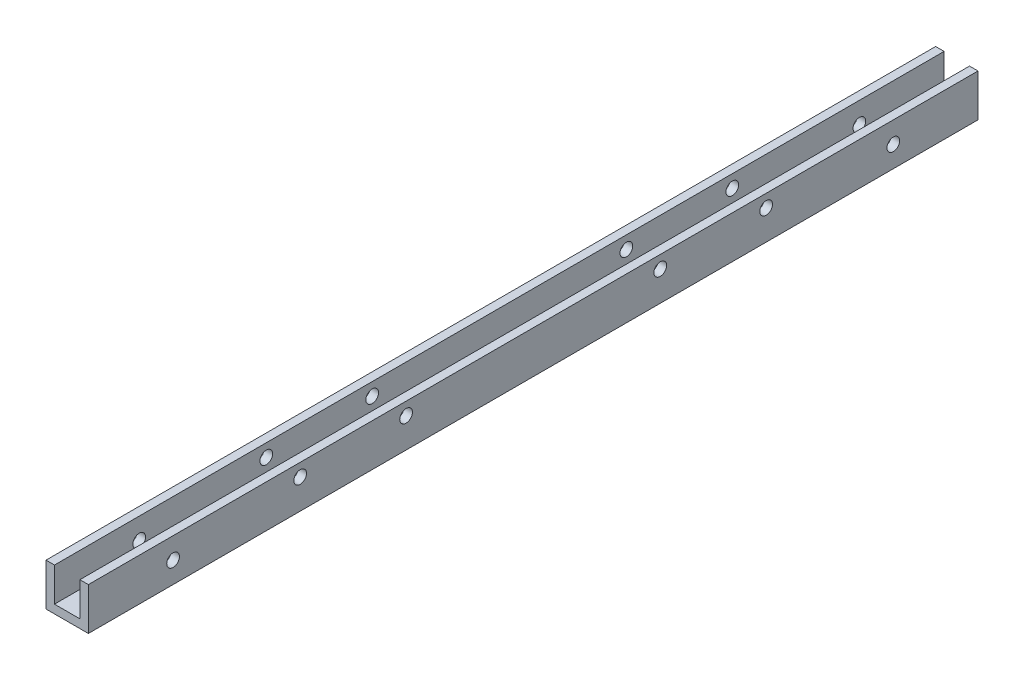
ISO-10303-21;
HEADER;
FILE_DESCRIPTION(('STEP AP214'),'2;1');
FILE_NAME('part.step','',(''),(''),'','','');
FILE_SCHEMA(('AUTOMOTIVE_DESIGN { 1 0 10303 214 1 1 1 1 }'));
ENDSEC;
DATA;
#1=APPLICATION_CONTEXT('core data for automotive mechanical design processes');
#2=APPLICATION_PROTOCOL_DEFINITION('international standard','automotive_design',2000,#1);
#3=PRODUCT_CONTEXT('',#1,'mechanical');
#4=PRODUCT('Part','Part','',(#3));
#5=PRODUCT_RELATED_PRODUCT_CATEGORY('part','',(#4));
#6=PRODUCT_DEFINITION_FORMATION('','',#4);
#7=PRODUCT_DEFINITION_CONTEXT('part definition',#1,'design');
#8=PRODUCT_DEFINITION('design','',#6,#7);
#9=PRODUCT_DEFINITION_SHAPE('','',#8);
#10=(LENGTH_UNIT() NAMED_UNIT(*) SI_UNIT(.MILLI.,.METRE.));
#11=(NAMED_UNIT(*) PLANE_ANGLE_UNIT() SI_UNIT($,.RADIAN.));
#12=(NAMED_UNIT(*) SI_UNIT($,.STERADIAN.) SOLID_ANGLE_UNIT());
#13=UNCERTAINTY_MEASURE_WITH_UNIT(LENGTH_MEASURE(1.E-05),#10,'distance_accuracy_value','');
#14=(GEOMETRIC_REPRESENTATION_CONTEXT(3) GLOBAL_UNCERTAINTY_ASSIGNED_CONTEXT((#13)) GLOBAL_UNIT_ASSIGNED_CONTEXT((#10,
#11,#12)) REPRESENTATION_CONTEXT('',''));
#15=CARTESIAN_POINT('',(0.,0.,0.));
#16=DIRECTION('',(0.,0.,1.));
#17=DIRECTION('',(1.,0.,0.));
#18=AXIS2_PLACEMENT_3D('',#15,#16,#17);
#19=CARTESIAN_POINT('',(-5.47826086956522,3.67391304347826,210.));
#20=DIRECTION('',(1.,0.,0.));
#21=DIRECTION('',(0.,0.,-1.));
#22=AXIS2_PLACEMENT_3D('',#19,#20,#21);
#23=PLANE('',#22);
#24=CARTESIAN_POINT('',(-5.47826086956522,-1.32608695652174,20.));
#25=DIRECTION('',(1.,0.,0.));
#26=DIRECTION('',(0.,1.,0.));
#27=AXIS2_PLACEMENT_3D('',#24,#25,#26);
#28=CIRCLE('',#27,1.5);
#29=CARTESIAN_POINT('',(-5.47826086956522,0.173913043478258,20.));
#30=VERTEX_POINT('',#29);
#31=EDGE_CURVE('E208',#30,#30,#28,.T.);
#32=ORIENTED_EDGE('',*,*,#31,.T.);
#33=EDGE_LOOP('',(#32));
#34=FACE_BOUND('',#33,.T.);
#35=CARTESIAN_POINT('',(-5.47826086956522,-1.32608695652174,190.));
#36=DIRECTION('',(1.,0.,0.));
#37=DIRECTION('',(0.,1.,0.));
#38=AXIS2_PLACEMENT_3D('',#35,#36,#37);
#39=CIRCLE('',#38,1.5);
#40=CARTESIAN_POINT('',(-5.47826086956522,0.173913043478255,190.));
#41=VERTEX_POINT('',#40);
#42=EDGE_CURVE('E324',#41,#41,#39,.T.);
#43=ORIENTED_EDGE('',*,*,#42,.T.);
#44=EDGE_LOOP('',(#43));
#45=FACE_BOUND('',#44,.T.);
#46=CARTESIAN_POINT('',(-5.47826086956522,0.673913043478259,160.));
#47=DIRECTION('',(1.,0.,0.));
#48=DIRECTION('',(0.,1.,0.));
#49=AXIS2_PLACEMENT_3D('',#46,#47,#48);
#50=CIRCLE('',#49,1.5);
#51=CARTESIAN_POINT('',(-5.47826086956522,2.17391304347826,160.));
#52=VERTEX_POINT('',#51);
#53=EDGE_CURVE('E189',#52,#52,#50,.T.);
#54=ORIENTED_EDGE('',*,*,#53,.T.);
#55=EDGE_LOOP('',(#54));
#56=FACE_BOUND('',#55,.T.);
#57=CARTESIAN_POINT('',(-5.47826086956522,0.673913043478261,135.));
#58=DIRECTION('',(1.,0.,0.));
#59=DIRECTION('',(0.,1.,0.));
#60=AXIS2_PLACEMENT_3D('',#57,#58,#59);
#61=CIRCLE('',#60,1.5);
#62=CARTESIAN_POINT('',(-5.47826086956522,2.17391304347826,135.));
#63=VERTEX_POINT('',#62);
#64=EDGE_CURVE('E235',#63,#63,#61,.T.);
#65=ORIENTED_EDGE('',*,*,#64,.T.);
#66=EDGE_LOOP('',(#65));
#67=FACE_BOUND('',#66,.T.);
#68=CARTESIAN_POINT('',(-5.47826086956522,0.67391304347828,75.));
#69=DIRECTION('',(1.,0.,0.));
#70=DIRECTION('',(0.,1.,0.));
#71=AXIS2_PLACEMENT_3D('',#68,#69,#70);
#72=CIRCLE('',#71,1.50000000000001);
#73=CARTESIAN_POINT('',(-5.47826086956522,2.17391304347829,75.));
#74=VERTEX_POINT('',#73);
#75=EDGE_CURVE('E243',#74,#74,#72,.T.);
#76=ORIENTED_EDGE('',*,*,#75,.T.);
#77=EDGE_LOOP('',(#76));
#78=FACE_BOUND('',#77,.T.);
#79=CARTESIAN_POINT('',(-5.47826086956522,0.673913043478316,50.));
#80=DIRECTION('',(1.,0.,0.));
#81=DIRECTION('',(0.,1.,0.));
#82=AXIS2_PLACEMENT_3D('',#79,#80,#81);
#83=CIRCLE('',#82,1.5);
#84=CARTESIAN_POINT('',(-5.47826086956522,2.17391304347831,50.));
#85=VERTEX_POINT('',#84);
#86=EDGE_CURVE('E251',#85,#85,#83,.T.);
#87=ORIENTED_EDGE('',*,*,#86,.T.);
#88=EDGE_LOOP('',(#87));
#89=FACE_BOUND('',#88,.T.);
#90=DIRECTION('',(0.,-1.,0.));
#91=VECTOR('',#90,1.);
#92=CARTESIAN_POINT('',(-5.47826086956522,3.67391304347826,0.));
#93=LINE('',#92,#91);
#94=CARTESIAN_POINT('',(-5.47826086956522,3.67391304347826,0.));
#95=VERTEX_POINT('',#94);
#96=CARTESIAN_POINT('',(-5.47826086956522,-6.32608695652174,0.));
#97=VERTEX_POINT('',#96);
#98=EDGE_CURVE('E143',#95,#97,#93,.T.);
#99=ORIENTED_EDGE('',*,*,#98,.T.);
#100=DIRECTION('',(0.,0.,-1.));
#101=VECTOR('',#100,1.);
#102=CARTESIAN_POINT('',(-5.47826086956522,-6.32608695652174,210.));
#103=LINE('',#102,#101);
#104=CARTESIAN_POINT('',(-5.47826086956522,-6.32608695652174,210.));
#105=VERTEX_POINT('',#104);
#106=EDGE_CURVE('E11',#105,#97,#103,.T.);
#107=ORIENTED_EDGE('',*,*,#106,.F.);
#108=DIRECTION('',(0.,-1.,0.));
#109=VECTOR('',#108,1.);
#110=CARTESIAN_POINT('',(-5.47826086956522,3.67391304347826,210.));
#111=LINE('',#110,#109);
#112=CARTESIAN_POINT('',(-5.47826086956522,3.67391304347826,210.));
#113=VERTEX_POINT('',#112);
#114=EDGE_CURVE('E166',#113,#105,#111,.T.);
#115=ORIENTED_EDGE('',*,*,#114,.F.);
#116=DIRECTION('',(0.,0.,-1.));
#117=VECTOR('',#116,1.);
#118=CARTESIAN_POINT('',(-5.47826086956522,3.67391304347826,210.));
#119=LINE('',#118,#117);
#120=EDGE_CURVE('E139',#113,#95,#119,.T.);
#121=ORIENTED_EDGE('',*,*,#120,.T.);
#122=EDGE_LOOP('',(#99,#107,#115,#121));
#123=FACE_BOUND('',#122,.T.);
#124=ADVANCED_FACE('F40',(#34,#45,#56,#67,#78,#89,#123),#23,.F.);
#125=CARTESIAN_POINT('',(-5.47826086956522,-6.32608695652174,210.));
#126=DIRECTION('',(0.,1.,0.));
#127=DIRECTION('',(-1.,0.,0.));
#128=AXIS2_PLACEMENT_3D('',#125,#126,#127);
#129=PLANE('',#128);
#130=CARTESIAN_POINT('',(-0.478260869565221,-6.32608695652174,105.));
#131=DIRECTION('',(0.,-1.,0.));
#132=DIRECTION('',(1.,0.,0.));
#133=AXIS2_PLACEMENT_3D('',#130,#131,#132);
#134=CIRCLE('',#133,2.5);
#135=CARTESIAN_POINT('',(2.02173913043478,-6.32608695652174,105.));
#136=VERTEX_POINT('',#135);
#137=EDGE_CURVE('E557',#136,#136,#134,.T.);
#138=ORIENTED_EDGE('',*,*,#137,.F.);
#139=EDGE_LOOP('',(#138));
#140=FACE_BOUND('',#139,.T.);
#141=DIRECTION('',(1.,0.,0.));
#142=VECTOR('',#141,1.);
#143=CARTESIAN_POINT('',(-5.47826086956522,-6.32608695652174,0.));
#144=LINE('',#143,#142);
#145=CARTESIAN_POINT('',(4.52173913043478,-6.32608695652174,0.));
#146=VERTEX_POINT('',#145);
#147=EDGE_CURVE('E147',#97,#146,#144,.T.);
#148=ORIENTED_EDGE('',*,*,#147,.T.);
#149=DIRECTION('',(0.,0.,-1.));
#150=VECTOR('',#149,1.);
#151=CARTESIAN_POINT('',(4.52173913043478,-6.32608695652174,210.));
#152=LINE('',#151,#150);
#153=CARTESIAN_POINT('',(4.52173913043478,-6.32608695652174,210.));
#154=VERTEX_POINT('',#153);
#155=EDGE_CURVE('E50',#154,#146,#152,.T.);
#156=ORIENTED_EDGE('',*,*,#155,.F.);
#157=DIRECTION('',(1.,0.,0.));
#158=VECTOR('',#157,1.);
#159=CARTESIAN_POINT('',(-5.47826086956522,-6.32608695652174,210.));
#160=LINE('',#159,#158);
#161=EDGE_CURVE('E102',#105,#154,#160,.T.);
#162=ORIENTED_EDGE('',*,*,#161,.F.);
#163=ORIENTED_EDGE('',*,*,#106,.T.);
#164=EDGE_LOOP('',(#148,#156,#162,#163));
#165=FACE_BOUND('',#164,.T.);
#166=ADVANCED_FACE('F309',(#140,#165),#129,.F.);
#167=CARTESIAN_POINT('',(4.52173913043478,3.67391304347826,210.));
#168=DIRECTION('',(-1.,0.,0.));
#169=DIRECTION('',(0.,-1.,0.));
#170=AXIS2_PLACEMENT_3D('',#167,#168,#169);
#171=PLANE('',#170);
#172=CARTESIAN_POINT('',(4.52173913043478,-1.32608695652174,20.));
#173=DIRECTION('',(1.,0.,0.));
#174=DIRECTION('',(0.,1.,0.));
#175=AXIS2_PLACEMENT_3D('',#172,#173,#174);
#176=CIRCLE('',#175,1.5);
#177=CARTESIAN_POINT('',(4.52173913043478,0.173913043478261,20.));
#178=VERTEX_POINT('',#177);
#179=EDGE_CURVE('E382',#178,#178,#176,.T.);
#180=ORIENTED_EDGE('',*,*,#179,.F.);
#181=EDGE_LOOP('',(#180));
#182=FACE_BOUND('',#181,.T.);
#183=CARTESIAN_POINT('',(4.52173913043478,-1.32608695652174,190.));
#184=DIRECTION('',(1.,0.,0.));
#185=DIRECTION('',(0.,1.,0.));
#186=AXIS2_PLACEMENT_3D('',#183,#184,#185);
#187=CIRCLE('',#186,1.5);
#188=CARTESIAN_POINT('',(4.52173913043478,0.173913043478258,190.));
#189=VERTEX_POINT('',#188);
#190=EDGE_CURVE('E225',#189,#189,#187,.T.);
#191=ORIENTED_EDGE('',*,*,#190,.F.);
#192=EDGE_LOOP('',(#191));
#193=FACE_BOUND('',#192,.T.);
#194=CARTESIAN_POINT('',(4.52173913043478,0.673913043478263,160.));
#195=DIRECTION('',(1.,0.,0.));
#196=DIRECTION('',(0.,1.,0.));
#197=AXIS2_PLACEMENT_3D('',#194,#195,#196);
#198=CIRCLE('',#197,1.5);
#199=CARTESIAN_POINT('',(4.52173913043478,2.17391304347826,160.));
#200=VERTEX_POINT('',#199);
#201=EDGE_CURVE('E231',#200,#200,#198,.T.);
#202=ORIENTED_EDGE('',*,*,#201,.F.);
#203=EDGE_LOOP('',(#202));
#204=FACE_BOUND('',#203,.T.);
#205=CARTESIAN_POINT('',(4.52173913043478,0.673913043478264,135.));
#206=DIRECTION('',(1.,0.,0.));
#207=DIRECTION('',(0.,1.,0.));
#208=AXIS2_PLACEMENT_3D('',#205,#206,#207);
#209=CIRCLE('',#208,1.5);
#210=CARTESIAN_POINT('',(4.52173913043478,2.17391304347826,135.));
#211=VERTEX_POINT('',#210);
#212=EDGE_CURVE('E239',#211,#211,#209,.T.);
#213=ORIENTED_EDGE('',*,*,#212,.F.);
#214=EDGE_LOOP('',(#213));
#215=FACE_BOUND('',#214,.T.);
#216=CARTESIAN_POINT('',(4.52173913043478,0.673913043478284,75.));
#217=DIRECTION('',(1.,0.,0.));
#218=DIRECTION('',(0.,1.,0.));
#219=AXIS2_PLACEMENT_3D('',#216,#217,#218);
#220=CIRCLE('',#219,1.50000000000001);
#221=CARTESIAN_POINT('',(4.52173913043478,2.17391304347829,75.));
#222=VERTEX_POINT('',#221);
#223=EDGE_CURVE('E247',#222,#222,#220,.T.);
#224=ORIENTED_EDGE('',*,*,#223,.F.);
#225=EDGE_LOOP('',(#224));
#226=FACE_BOUND('',#225,.T.);
#227=CARTESIAN_POINT('',(4.52173913043478,0.67391304347832,50.));
#228=DIRECTION('',(1.,0.,0.));
#229=DIRECTION('',(0.,1.,0.));
#230=AXIS2_PLACEMENT_3D('',#227,#228,#229);
#231=CIRCLE('',#230,1.5);
#232=CARTESIAN_POINT('',(4.52173913043478,2.17391304347832,50.));
#233=VERTEX_POINT('',#232);
#234=EDGE_CURVE('E218',#233,#233,#231,.T.);
#235=ORIENTED_EDGE('',*,*,#234,.F.);
#236=EDGE_LOOP('',(#235));
#237=FACE_BOUND('',#236,.T.);
#238=DIRECTION('',(0.,1.,0.));
#239=VECTOR('',#238,1.);
#240=CARTESIAN_POINT('',(4.52173913043478,3.67391304347826,0.));
#241=LINE('',#240,#239);
#242=CARTESIAN_POINT('',(4.52173913043478,3.67391304347826,0.));
#243=VERTEX_POINT('',#242);
#244=EDGE_CURVE('E151',#146,#243,#241,.T.);
#245=ORIENTED_EDGE('',*,*,#244,.T.);
#246=DIRECTION('',(0.,0.,-1.));
#247=VECTOR('',#246,1.);
#248=CARTESIAN_POINT('',(4.52173913043478,3.67391304347826,210.));
#249=LINE('',#248,#247);
#250=CARTESIAN_POINT('',(4.52173913043478,3.67391304347826,210.));
#251=VERTEX_POINT('',#250);
#252=EDGE_CURVE('E177',#251,#243,#249,.T.);
#253=ORIENTED_EDGE('',*,*,#252,.F.);
#254=DIRECTION('',(0.,1.,0.));
#255=VECTOR('',#254,1.);
#256=CARTESIAN_POINT('',(4.52173913043478,3.67391304347826,210.));
#257=LINE('',#256,#255);
#258=EDGE_CURVE('E274',#154,#251,#257,.T.);
#259=ORIENTED_EDGE('',*,*,#258,.F.);
#260=ORIENTED_EDGE('',*,*,#155,.T.);
#261=EDGE_LOOP('',(#245,#253,#259,#260));
#262=FACE_BOUND('',#261,.T.);
#263=ADVANCED_FACE('F316',(#182,#193,#204,#215,#226,#237,#262),#171,.F.);
#264=CARTESIAN_POINT('',(2.52173913043478,3.67391304347826,210.));
#265=DIRECTION('',(0.,-1.,0.));
#266=DIRECTION('',(0.,0.,-1.));
#267=AXIS2_PLACEMENT_3D('',#264,#265,#266);
#268=PLANE('',#267);
#269=DIRECTION('',(-1.,0.,0.));
#270=VECTOR('',#269,1.);
#271=CARTESIAN_POINT('',(2.52173913043478,3.67391304347826,0.));
#272=LINE('',#271,#270);
#273=CARTESIAN_POINT('',(2.52173913043478,3.67391304347826,0.));
#274=VERTEX_POINT('',#273);
#275=EDGE_CURVE('E154',#243,#274,#272,.T.);
#276=ORIENTED_EDGE('',*,*,#275,.T.);
#277=DIRECTION('',(0.,0.,-1.));
#278=VECTOR('',#277,1.);
#279=CARTESIAN_POINT('',(2.52173913043478,3.67391304347826,210.));
#280=LINE('',#279,#278);
#281=CARTESIAN_POINT('',(2.52173913043478,3.67391304347826,210.));
#282=VERTEX_POINT('',#281);
#283=EDGE_CURVE('E173',#282,#274,#280,.T.);
#284=ORIENTED_EDGE('',*,*,#283,.F.);
#285=DIRECTION('',(-1.,0.,0.));
#286=VECTOR('',#285,1.);
#287=CARTESIAN_POINT('',(2.52173913043478,3.67391304347826,210.));
#288=LINE('',#287,#286);
#289=EDGE_CURVE('E277',#251,#282,#288,.T.);
#290=ORIENTED_EDGE('',*,*,#289,.F.);
#291=ORIENTED_EDGE('',*,*,#252,.T.);
#292=EDGE_LOOP('',(#276,#284,#290,#291));
#293=FACE_BOUND('',#292,.T.);
#294=ADVANCED_FACE('F285',(#293),#268,.F.);
#295=CARTESIAN_POINT('',(2.52173913043478,3.67391304347826,210.));
#296=DIRECTION('',(1.,0.,0.));
#297=DIRECTION('',(0.,1.,0.));
#298=AXIS2_PLACEMENT_3D('',#295,#296,#297);
#299=PLANE('',#298);
#300=CARTESIAN_POINT('',(2.52173913043478,-1.32608695652174,20.));
#301=DIRECTION('',(1.,0.,0.));
#302=DIRECTION('',(0.,1.,0.));
#303=AXIS2_PLACEMENT_3D('',#300,#301,#302);
#304=CIRCLE('',#303,1.5);
#305=CARTESIAN_POINT('',(2.52173913043478,0.173913043478261,20.));
#306=VERTEX_POINT('',#305);
#307=EDGE_CURVE('E212',#306,#306,#304,.T.);
#308=ORIENTED_EDGE('',*,*,#307,.T.);
#309=EDGE_LOOP('',(#308));
#310=FACE_BOUND('',#309,.T.);
#311=CARTESIAN_POINT('',(2.52173913043478,-1.32608695652174,190.));
#312=DIRECTION('',(1.,0.,0.));
#313=DIRECTION('',(0.,1.,0.));
#314=AXIS2_PLACEMENT_3D('',#311,#312,#313);
#315=CIRCLE('',#314,1.5);
#316=CARTESIAN_POINT('',(2.52173913043478,0.173913043478257,190.));
#317=VERTEX_POINT('',#316);
#318=EDGE_CURVE('E207',#317,#317,#315,.T.);
#319=ORIENTED_EDGE('',*,*,#318,.T.);
#320=EDGE_LOOP('',(#319));
#321=FACE_BOUND('',#320,.T.);
#322=CARTESIAN_POINT('',(2.52173913043478,0.673913043478262,160.));
#323=DIRECTION('',(1.,0.,0.));
#324=DIRECTION('',(0.,1.,0.));
#325=AXIS2_PLACEMENT_3D('',#322,#323,#324);
#326=CIRCLE('',#325,1.5);
#327=CARTESIAN_POINT('',(2.52173913043478,2.17391304347826,160.));
#328=VERTEX_POINT('',#327);
#329=EDGE_CURVE('E148',#328,#328,#326,.T.);
#330=ORIENTED_EDGE('',*,*,#329,.T.);
#331=EDGE_LOOP('',(#330));
#332=FACE_BOUND('',#331,.T.);
#333=CARTESIAN_POINT('',(2.52173913043478,0.673913043478264,135.));
#334=DIRECTION('',(1.,0.,0.));
#335=DIRECTION('',(0.,1.,0.));
#336=AXIS2_PLACEMENT_3D('',#333,#334,#335);
#337=CIRCLE('',#336,1.5);
#338=CARTESIAN_POINT('',(2.52173913043478,2.17391304347826,135.));
#339=VERTEX_POINT('',#338);
#340=EDGE_CURVE('E199',#339,#339,#337,.T.);
#341=ORIENTED_EDGE('',*,*,#340,.T.);
#342=EDGE_LOOP('',(#341));
#343=FACE_BOUND('',#342,.T.);
#344=CARTESIAN_POINT('',(2.52173913043478,0.673913043478283,75.));
#345=DIRECTION('',(1.,0.,0.));
#346=DIRECTION('',(0.,1.,0.));
#347=AXIS2_PLACEMENT_3D('',#344,#345,#346);
#348=CIRCLE('',#347,1.50000000000001);
#349=CARTESIAN_POINT('',(2.52173913043478,2.17391304347829,75.));
#350=VERTEX_POINT('',#349);
#351=EDGE_CURVE('E194',#350,#350,#348,.T.);
#352=ORIENTED_EDGE('',*,*,#351,.T.);
#353=EDGE_LOOP('',(#352));
#354=FACE_BOUND('',#353,.T.);
#355=CARTESIAN_POINT('',(2.52173913043478,0.673913043478319,50.));
#356=DIRECTION('',(1.,0.,0.));
#357=DIRECTION('',(0.,1.,0.));
#358=AXIS2_PLACEMENT_3D('',#355,#356,#357);
#359=CIRCLE('',#358,1.5);
#360=CARTESIAN_POINT('',(2.52173913043478,2.17391304347832,50.));
#361=VERTEX_POINT('',#360);
#362=EDGE_CURVE('E188',#361,#361,#359,.T.);
#363=ORIENTED_EDGE('',*,*,#362,.T.);
#364=EDGE_LOOP('',(#363));
#365=FACE_BOUND('',#364,.T.);
#366=DIRECTION('',(0.,-1.,0.));
#367=VECTOR('',#366,1.);
#368=CARTESIAN_POINT('',(2.52173913043478,3.67391304347826,0.));
#369=LINE('',#368,#367);
#370=CARTESIAN_POINT('',(2.52173913043478,-4.32608695652174,0.));
#371=VERTEX_POINT('',#370);
#372=EDGE_CURVE('E157',#274,#371,#369,.T.);
#373=ORIENTED_EDGE('',*,*,#372,.T.);
#374=DIRECTION('',(0.,0.,-1.));
#375=VECTOR('',#374,1.);
#376=CARTESIAN_POINT('',(2.52173913043478,-4.32608695652174,210.));
#377=LINE('',#376,#375);
#378=CARTESIAN_POINT('',(2.52173913043478,-4.32608695652174,210.));
#379=VERTEX_POINT('',#378);
#380=EDGE_CURVE('E132',#379,#371,#377,.T.);
#381=ORIENTED_EDGE('',*,*,#380,.F.);
#382=DIRECTION('',(0.,-1.,0.));
#383=VECTOR('',#382,1.);
#384=CARTESIAN_POINT('',(2.52173913043478,3.67391304347826,210.));
#385=LINE('',#384,#383);
#386=EDGE_CURVE('E121',#282,#379,#385,.T.);
#387=ORIENTED_EDGE('',*,*,#386,.F.);
#388=ORIENTED_EDGE('',*,*,#283,.T.);
#389=EDGE_LOOP('',(#373,#381,#387,#388));
#390=FACE_BOUND('',#389,.T.);
#391=ADVANCED_FACE('F289',(#310,#321,#332,#343,#354,#365,#390),#299,.F.);
#392=CARTESIAN_POINT('',(-3.47826086956522,-4.32608695652174,210.));
#393=DIRECTION('',(0.,-1.,0.));
#394=DIRECTION('',(0.,0.,-1.));
#395=AXIS2_PLACEMENT_3D('',#392,#393,#394);
#396=PLANE('',#395);
#397=CARTESIAN_POINT('',(-0.478260869565221,-4.32608695652174,105.));
#398=DIRECTION('',(0.,-1.,0.));
#399=DIRECTION('',(0.,0.,-1.));
#400=AXIS2_PLACEMENT_3D('',#397,#398,#399);
#401=CIRCLE('',#400,2.5);
#402=CARTESIAN_POINT('',(-0.478260869565221,-4.32608695652174,102.5));
#403=VERTEX_POINT('',#402);
#404=EDGE_CURVE('E43',#403,#403,#401,.T.);
#405=ORIENTED_EDGE('',*,*,#404,.T.);
#406=EDGE_LOOP('',(#405));
#407=FACE_BOUND('',#406,.T.);
#408=DIRECTION('',(-1.,0.,0.));
#409=VECTOR('',#408,1.);
#410=CARTESIAN_POINT('',(-3.47826086956522,-4.32608695652174,0.));
#411=LINE('',#410,#409);
#412=CARTESIAN_POINT('',(-3.47826086956522,-4.32608695652174,0.));
#413=VERTEX_POINT('',#412);
#414=EDGE_CURVE('E130',#371,#413,#411,.T.);
#415=ORIENTED_EDGE('',*,*,#414,.T.);
#416=DIRECTION('',(0.,0.,-1.));
#417=VECTOR('',#416,1.);
#418=CARTESIAN_POINT('',(-3.47826086956522,-4.32608695652174,210.));
#419=LINE('',#418,#417);
#420=CARTESIAN_POINT('',(-3.47826086956522,-4.32608695652174,210.));
#421=VERTEX_POINT('',#420);
#422=EDGE_CURVE('E127',#421,#413,#419,.T.);
#423=ORIENTED_EDGE('',*,*,#422,.F.);
#424=DIRECTION('',(-1.,0.,0.));
#425=VECTOR('',#424,1.);
#426=CARTESIAN_POINT('',(-3.47826086956522,-4.32608695652174,210.));
#427=LINE('',#426,#425);
#428=EDGE_CURVE('E115',#379,#421,#427,.T.);
#429=ORIENTED_EDGE('',*,*,#428,.F.);
#430=ORIENTED_EDGE('',*,*,#380,.T.);
#431=EDGE_LOOP('',(#415,#423,#429,#430));
#432=FACE_BOUND('',#431,.T.);
#433=ADVANCED_FACE('F128',(#407,#432),#396,.F.);
#434=CARTESIAN_POINT('',(-3.47826086956522,3.67391304347826,210.));
#435=DIRECTION('',(-1.,0.,0.));
#436=DIRECTION('',(0.,-1.,0.));
#437=AXIS2_PLACEMENT_3D('',#434,#435,#436);
#438=PLANE('',#437);
#439=CARTESIAN_POINT('',(-3.47826086956522,-1.32608695652174,20.));
#440=DIRECTION('',(-1.,0.,0.));
#441=DIRECTION('',(0.,-1.,0.));
#442=AXIS2_PLACEMENT_3D('',#439,#440,#441);
#443=CIRCLE('',#442,1.5);
#444=CARTESIAN_POINT('',(-3.47826086956522,-2.82608695652174,20.));
#445=VERTEX_POINT('',#444);
#446=EDGE_CURVE('E209',#445,#445,#443,.T.);
#447=ORIENTED_EDGE('',*,*,#446,.T.);
#448=EDGE_LOOP('',(#447));
#449=FACE_BOUND('',#448,.T.);
#450=CARTESIAN_POINT('',(-3.47826086956522,-1.32608695652174,190.));
#451=DIRECTION('',(-1.,0.,0.));
#452=DIRECTION('',(0.,-1.,0.));
#453=AXIS2_PLACEMENT_3D('',#450,#451,#452);
#454=CIRCLE('',#453,1.5);
#455=CARTESIAN_POINT('',(-3.47826086956522,-2.82608695652174,190.));
#456=VERTEX_POINT('',#455);
#457=EDGE_CURVE('E204',#456,#456,#454,.T.);
#458=ORIENTED_EDGE('',*,*,#457,.T.);
#459=EDGE_LOOP('',(#458));
#460=FACE_BOUND('',#459,.T.);
#461=CARTESIAN_POINT('',(-3.47826086956522,0.67391304347826,160.));
#462=DIRECTION('',(-1.,0.,0.));
#463=DIRECTION('',(0.,-1.,0.));
#464=AXIS2_PLACEMENT_3D('',#461,#462,#463);
#465=CIRCLE('',#464,1.5);
#466=CARTESIAN_POINT('',(-3.47826086956522,-0.826086956521737,160.));
#467=VERTEX_POINT('',#466);
#468=EDGE_CURVE('E200',#467,#467,#465,.T.);
#469=ORIENTED_EDGE('',*,*,#468,.T.);
#470=EDGE_LOOP('',(#469));
#471=FACE_BOUND('',#470,.T.);
#472=CARTESIAN_POINT('',(-3.47826086956522,0.673913043478262,135.));
#473=DIRECTION('',(-1.,0.,0.));
#474=DIRECTION('',(0.,-1.,0.));
#475=AXIS2_PLACEMENT_3D('',#472,#473,#474);
#476=CIRCLE('',#475,1.5);
#477=CARTESIAN_POINT('',(-3.47826086956522,-0.826086956521736,135.));
#478=VERTEX_POINT('',#477);
#479=EDGE_CURVE('E195',#478,#478,#476,.T.);
#480=ORIENTED_EDGE('',*,*,#479,.T.);
#481=EDGE_LOOP('',(#480));
#482=FACE_BOUND('',#481,.T.);
#483=CARTESIAN_POINT('',(-3.47826086956522,0.673913043478281,75.));
#484=DIRECTION('',(-1.,0.,0.));
#485=DIRECTION('',(0.,-1.,0.));
#486=AXIS2_PLACEMENT_3D('',#483,#484,#485);
#487=CIRCLE('',#486,1.50000000000001);
#488=CARTESIAN_POINT('',(-3.47826086956522,-0.826086956521731,75.));
#489=VERTEX_POINT('',#488);
#490=EDGE_CURVE('E190',#489,#489,#487,.T.);
#491=ORIENTED_EDGE('',*,*,#490,.T.);
#492=EDGE_LOOP('',(#491));
#493=FACE_BOUND('',#492,.T.);
#494=CARTESIAN_POINT('',(-3.47826086956522,0.673913043478317,50.));
#495=DIRECTION('',(-1.,0.,0.));
#496=DIRECTION('',(0.,-1.,0.));
#497=AXIS2_PLACEMENT_3D('',#494,#495,#496);
#498=CIRCLE('',#497,1.5);
#499=CARTESIAN_POINT('',(-3.47826086956522,-0.82608695652168,50.));
#500=VERTEX_POINT('',#499);
#501=EDGE_CURVE('E184',#500,#500,#498,.T.);
#502=ORIENTED_EDGE('',*,*,#501,.T.);
#503=EDGE_LOOP('',(#502));
#504=FACE_BOUND('',#503,.T.);
#505=DIRECTION('',(0.,1.,0.));
#506=VECTOR('',#505,1.);
#507=CARTESIAN_POINT('',(-3.47826086956522,3.67391304347826,0.));
#508=LINE('',#507,#506);
#509=CARTESIAN_POINT('',(-3.47826086956522,3.67391304347826,0.));
#510=VERTEX_POINT('',#509);
#511=EDGE_CURVE('E88',#413,#510,#508,.T.);
#512=ORIENTED_EDGE('',*,*,#511,.T.);
#513=DIRECTION('',(0.,0.,-1.));
#514=VECTOR('',#513,1.);
#515=CARTESIAN_POINT('',(-3.47826086956522,3.67391304347826,210.));
#516=LINE('',#515,#514);
#517=CARTESIAN_POINT('',(-3.47826086956522,3.67391304347826,210.));
#518=VERTEX_POINT('',#517);
#519=EDGE_CURVE('E133',#518,#510,#516,.T.);
#520=ORIENTED_EDGE('',*,*,#519,.F.);
#521=DIRECTION('',(0.,1.,0.));
#522=VECTOR('',#521,1.);
#523=CARTESIAN_POINT('',(-3.47826086956522,3.67391304347826,210.));
#524=LINE('',#523,#522);
#525=EDGE_CURVE('E119',#421,#518,#524,.T.);
#526=ORIENTED_EDGE('',*,*,#525,.F.);
#527=ORIENTED_EDGE('',*,*,#422,.T.);
#528=EDGE_LOOP('',(#512,#520,#526,#527));
#529=FACE_BOUND('',#528,.T.);
#530=ADVANCED_FACE('F135',(#449,#460,#471,#482,#493,#504,#529),#438,.F.);
#531=CARTESIAN_POINT('',(-5.47826086956522,3.67391304347826,210.));
#532=DIRECTION('',(0.,-1.,0.));
#533=DIRECTION('',(0.,0.,-1.));
#534=AXIS2_PLACEMENT_3D('',#531,#532,#533);
#535=PLANE('',#534);
#536=DIRECTION('',(-1.,0.,0.));
#537=VECTOR('',#536,1.);
#538=CARTESIAN_POINT('',(-5.47826086956522,3.67391304347826,0.));
#539=LINE('',#538,#537);
#540=EDGE_CURVE('E94',#510,#95,#539,.T.);
#541=ORIENTED_EDGE('',*,*,#540,.T.);
#542=ORIENTED_EDGE('',*,*,#120,.F.);
#543=DIRECTION('',(-1.,0.,0.));
#544=VECTOR('',#543,1.);
#545=CARTESIAN_POINT('',(-5.47826086956522,3.67391304347826,210.));
#546=LINE('',#545,#544);
#547=EDGE_CURVE('E59',#518,#113,#546,.T.);
#548=ORIENTED_EDGE('',*,*,#547,.F.);
#549=ORIENTED_EDGE('',*,*,#519,.T.);
#550=EDGE_LOOP('',(#541,#542,#548,#549));
#551=FACE_BOUND('',#550,.T.);
#552=ADVANCED_FACE('F297',(#551),#535,.F.);
#553=CARTESIAN_POINT('',(0.,0.,210.));
#554=DIRECTION('',(0.,0.,1.));
#555=DIRECTION('',(1.,0.,0.));
#556=AXIS2_PLACEMENT_3D('',#553,#554,#555);
#557=PLANE('',#556);
#558=ORIENTED_EDGE('',*,*,#114,.T.);
#559=ORIENTED_EDGE('',*,*,#161,.T.);
#560=ORIENTED_EDGE('',*,*,#258,.T.);
#561=ORIENTED_EDGE('',*,*,#289,.T.);
#562=ORIENTED_EDGE('',*,*,#386,.T.);
#563=ORIENTED_EDGE('',*,*,#428,.T.);
#564=ORIENTED_EDGE('',*,*,#525,.T.);
#565=ORIENTED_EDGE('',*,*,#547,.T.);
#566=EDGE_LOOP('',(#558,#559,#560,#561,#562,#563,#564,#565));
#567=FACE_BOUND('',#566,.T.);
#568=ADVANCED_FACE('F117',(#567),#557,.T.);
#569=CARTESIAN_POINT('',(0.,0.,0.));
#570=DIRECTION('',(0.,0.,1.));
#571=DIRECTION('',(1.,0.,0.));
#572=AXIS2_PLACEMENT_3D('',#569,#570,#571);
#573=PLANE('',#572);
#574=ORIENTED_EDGE('',*,*,#98,.F.);
#575=ORIENTED_EDGE('',*,*,#540,.F.);
#576=ORIENTED_EDGE('',*,*,#511,.F.);
#577=ORIENTED_EDGE('',*,*,#414,.F.);
#578=ORIENTED_EDGE('',*,*,#372,.F.);
#579=ORIENTED_EDGE('',*,*,#275,.F.);
#580=ORIENTED_EDGE('',*,*,#244,.F.);
#581=ORIENTED_EDGE('',*,*,#147,.F.);
#582=EDGE_LOOP('',(#574,#575,#576,#577,#578,#579,#580,#581));
#583=FACE_BOUND('',#582,.T.);
#584=ADVANCED_FACE('F292',(#583),#573,.F.);
#585=CARTESIAN_POINT('',(-5.47826086956522,0.673913043478316,50.));
#586=DIRECTION('',(1.,0.,0.));
#587=DIRECTION('',(0.,1.,0.));
#588=AXIS2_PLACEMENT_3D('',#585,#586,#587);
#589=CYLINDRICAL_SURFACE('',#588,1.5);
#590=ORIENTED_EDGE('',*,*,#86,.F.);
#591=EDGE_LOOP('',(#590));
#592=FACE_BOUND('',#591,.T.);
#593=ORIENTED_EDGE('',*,*,#501,.F.);
#594=EDGE_LOOP('',(#593));
#595=FACE_BOUND('',#594,.T.);
#596=ADVANCED_FACE('F333',(#592,#595),#589,.F.);
#597=CARTESIAN_POINT('',(-5.47826086956522,0.67391304347828,75.));
#598=DIRECTION('',(1.,0.,0.));
#599=DIRECTION('',(0.,1.,0.));
#600=AXIS2_PLACEMENT_3D('',#597,#598,#599);
#601=CYLINDRICAL_SURFACE('',#600,1.50000000000001);
#602=ORIENTED_EDGE('',*,*,#75,.F.);
#603=EDGE_LOOP('',(#602));
#604=FACE_BOUND('',#603,.T.);
#605=ORIENTED_EDGE('',*,*,#490,.F.);
#606=EDGE_LOOP('',(#605));
#607=FACE_BOUND('',#606,.T.);
#608=ADVANCED_FACE('F336',(#604,#607),#601,.F.);
#609=CARTESIAN_POINT('',(-5.47826086956522,0.673913043478261,135.));
#610=DIRECTION('',(1.,0.,0.));
#611=DIRECTION('',(0.,1.,0.));
#612=AXIS2_PLACEMENT_3D('',#609,#610,#611);
#613=CYLINDRICAL_SURFACE('',#612,1.5);
#614=ORIENTED_EDGE('',*,*,#64,.F.);
#615=EDGE_LOOP('',(#614));
#616=FACE_BOUND('',#615,.T.);
#617=ORIENTED_EDGE('',*,*,#479,.F.);
#618=EDGE_LOOP('',(#617));
#619=FACE_BOUND('',#618,.T.);
#620=ADVANCED_FACE('F345',(#616,#619),#613,.F.);
#621=CARTESIAN_POINT('',(-5.47826086956522,0.673913043478259,160.));
#622=DIRECTION('',(1.,0.,0.));
#623=DIRECTION('',(0.,1.,0.));
#624=AXIS2_PLACEMENT_3D('',#621,#622,#623);
#625=CYLINDRICAL_SURFACE('',#624,1.5);
#626=ORIENTED_EDGE('',*,*,#53,.F.);
#627=EDGE_LOOP('',(#626));
#628=FACE_BOUND('',#627,.T.);
#629=ORIENTED_EDGE('',*,*,#468,.F.);
#630=EDGE_LOOP('',(#629));
#631=FACE_BOUND('',#630,.T.);
#632=ADVANCED_FACE('F350',(#628,#631),#625,.F.);
#633=ORIENTED_EDGE('',*,*,#234,.T.);
#634=EDGE_LOOP('',(#633));
#635=FACE_BOUND('',#634,.T.);
#636=ORIENTED_EDGE('',*,*,#362,.F.);
#637=EDGE_LOOP('',(#636));
#638=FACE_BOUND('',#637,.T.);
#639=ADVANCED_FACE('F338',(#635,#638),#589,.F.);
#640=ORIENTED_EDGE('',*,*,#223,.T.);
#641=EDGE_LOOP('',(#640));
#642=FACE_BOUND('',#641,.T.);
#643=ORIENTED_EDGE('',*,*,#351,.F.);
#644=EDGE_LOOP('',(#643));
#645=FACE_BOUND('',#644,.T.);
#646=ADVANCED_FACE('F348',(#642,#645),#601,.F.);
#647=ORIENTED_EDGE('',*,*,#212,.T.);
#648=EDGE_LOOP('',(#647));
#649=FACE_BOUND('',#648,.T.);
#650=ORIENTED_EDGE('',*,*,#340,.F.);
#651=EDGE_LOOP('',(#650));
#652=FACE_BOUND('',#651,.T.);
#653=ADVANCED_FACE('F356',(#649,#652),#613,.F.);
#654=ORIENTED_EDGE('',*,*,#201,.T.);
#655=EDGE_LOOP('',(#654));
#656=FACE_BOUND('',#655,.T.);
#657=ORIENTED_EDGE('',*,*,#329,.F.);
#658=EDGE_LOOP('',(#657));
#659=FACE_BOUND('',#658,.T.);
#660=ADVANCED_FACE('F360',(#656,#659),#625,.F.);
#661=CARTESIAN_POINT('',(-5.47826086956522,-1.32608695652174,190.));
#662=DIRECTION('',(1.,0.,0.));
#663=DIRECTION('',(0.,1.,0.));
#664=AXIS2_PLACEMENT_3D('',#661,#662,#663);
#665=CYLINDRICAL_SURFACE('',#664,1.5);
#666=ORIENTED_EDGE('',*,*,#42,.F.);
#667=EDGE_LOOP('',(#666));
#668=FACE_BOUND('',#667,.T.);
#669=ORIENTED_EDGE('',*,*,#457,.F.);
#670=EDGE_LOOP('',(#669));
#671=FACE_BOUND('',#670,.T.);
#672=ADVANCED_FACE('F405',(#668,#671),#665,.F.);
#673=CARTESIAN_POINT('',(-5.47826086956522,-1.32608695652174,20.));
#674=DIRECTION('',(1.,0.,0.));
#675=DIRECTION('',(0.,1.,0.));
#676=AXIS2_PLACEMENT_3D('',#673,#674,#675);
#677=CYLINDRICAL_SURFACE('',#676,1.5);
#678=ORIENTED_EDGE('',*,*,#31,.F.);
#679=EDGE_LOOP('',(#678));
#680=FACE_BOUND('',#679,.T.);
#681=ORIENTED_EDGE('',*,*,#446,.F.);
#682=EDGE_LOOP('',(#681));
#683=FACE_BOUND('',#682,.T.);
#684=ADVANCED_FACE('F451',(#680,#683),#677,.F.);
#685=ORIENTED_EDGE('',*,*,#190,.T.);
#686=EDGE_LOOP('',(#685));
#687=FACE_BOUND('',#686,.T.);
#688=ORIENTED_EDGE('',*,*,#318,.F.);
#689=EDGE_LOOP('',(#688));
#690=FACE_BOUND('',#689,.T.);
#691=ADVANCED_FACE('F454',(#687,#690),#665,.F.);
#692=ORIENTED_EDGE('',*,*,#179,.T.);
#693=EDGE_LOOP('',(#692));
#694=FACE_BOUND('',#693,.T.);
#695=ORIENTED_EDGE('',*,*,#307,.F.);
#696=EDGE_LOOP('',(#695));
#697=FACE_BOUND('',#696,.T.);
#698=ADVANCED_FACE('F461',(#694,#697),#677,.F.);
#699=CARTESIAN_POINT('',(-0.478260869565222,3.67391304347826,105.));
#700=DIRECTION('',(0.,-1.,0.));
#701=DIRECTION('',(1.,0.,0.));
#702=AXIS2_PLACEMENT_3D('',#699,#700,#701);
#703=CYLINDRICAL_SURFACE('',#702,2.5);
#704=ORIENTED_EDGE('',*,*,#137,.T.);
#705=EDGE_LOOP('',(#704));
#706=FACE_BOUND('',#705,.T.);
#707=ORIENTED_EDGE('',*,*,#404,.F.);
#708=EDGE_LOOP('',(#707));
#709=FACE_BOUND('',#708,.T.);
#710=ADVANCED_FACE('F473',(#706,#709),#703,.F.);
#711=CLOSED_SHELL('',(#124,#166,#263,#294,#391,#433,#530,#552,#568,#584,#596,#608,#620,#632,
#639,#646,#653,#660,#672,#684,#691,#698,#710));
#712=MANIFOLD_SOLID_BREP('B2',#711);
#713=ADVANCED_BREP_SHAPE_REPRESENTATION('',(#18,#712),#14);
#714=SHAPE_DEFINITION_REPRESENTATION(#9,#713);
ENDSEC;
END-ISO-10303-21;
